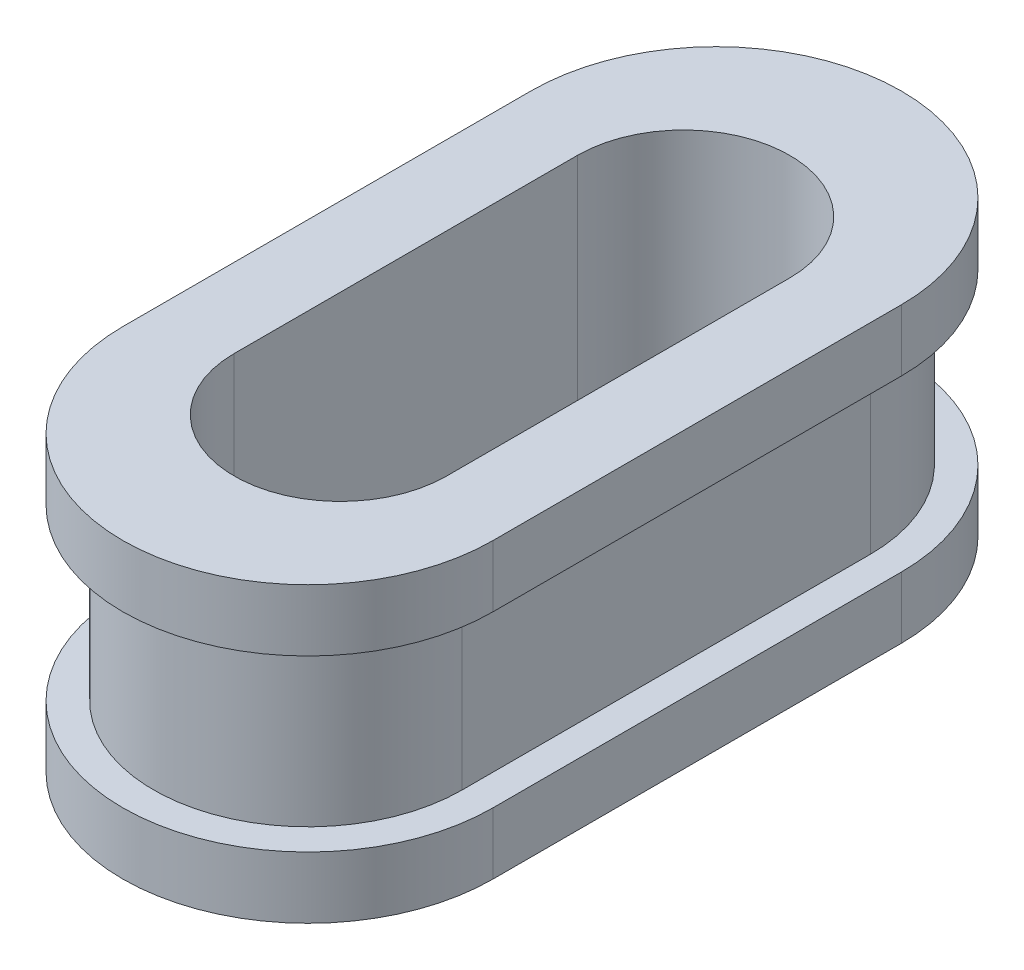
ISO-10303-21;
HEADER;
FILE_DESCRIPTION(('STEP AP214'),'2;1');
FILE_NAME('part.step','',(''),(''),'','','');
FILE_SCHEMA(('AUTOMOTIVE_DESIGN { 1 0 10303 214 1 1 1 1 }'));
ENDSEC;
DATA;
#1=APPLICATION_CONTEXT('core data for automotive mechanical design processes');
#2=APPLICATION_PROTOCOL_DEFINITION('international standard','automotive_design',2000,#1);
#3=PRODUCT_CONTEXT('',#1,'mechanical');
#4=PRODUCT('Part','Part','',(#3));
#5=PRODUCT_RELATED_PRODUCT_CATEGORY('part','',(#4));
#6=PRODUCT_DEFINITION_FORMATION('','',#4);
#7=PRODUCT_DEFINITION_CONTEXT('part definition',#1,'design');
#8=PRODUCT_DEFINITION('design','',#6,#7);
#9=PRODUCT_DEFINITION_SHAPE('','',#8);
#10=(LENGTH_UNIT() NAMED_UNIT(*) SI_UNIT(.MILLI.,.METRE.));
#11=(NAMED_UNIT(*) PLANE_ANGLE_UNIT() SI_UNIT($,.RADIAN.));
#12=(NAMED_UNIT(*) SI_UNIT($,.STERADIAN.) SOLID_ANGLE_UNIT());
#13=UNCERTAINTY_MEASURE_WITH_UNIT(LENGTH_MEASURE(1.E-05),#10,'distance_accuracy_value','');
#14=(GEOMETRIC_REPRESENTATION_CONTEXT(3) GLOBAL_UNCERTAINTY_ASSIGNED_CONTEXT((#13)) GLOBAL_UNIT_ASSIGNED_CONTEXT((#10,
#11,#12)) REPRESENTATION_CONTEXT('',''));
#15=CARTESIAN_POINT('',(0.,0.,0.));
#16=DIRECTION('',(0.,0.,1.));
#17=DIRECTION('',(1.,0.,0.));
#18=AXIS2_PLACEMENT_3D('',#15,#16,#17);
#19=CARTESIAN_POINT('',(0.,10.,-104.285653561065));
#20=DIRECTION('',(0.,-1.,0.));
#21=DIRECTION('',(0.,0.,-1.));
#22=AXIS2_PLACEMENT_3D('',#19,#20,#21);
#23=CYLINDRICAL_SURFACE('',#22,30.);
#24=CARTESIAN_POINT('',(0.,0.,-104.285653561065));
#25=DIRECTION('',(0.,1.,0.));
#26=DIRECTION('',(0.,0.,1.));
#27=AXIS2_PLACEMENT_3D('',#24,#25,#26);
#28=CIRCLE('',#27,30.);
#29=CARTESIAN_POINT('',(30.,0.,-104.285653561065));
#30=VERTEX_POINT('',#29);
#31=CARTESIAN_POINT('',(-30.,0.,-104.285653561065));
#32=VERTEX_POINT('',#31);
#33=EDGE_CURVE('E189',#30,#32,#28,.T.);
#34=ORIENTED_EDGE('',*,*,#33,.T.);
#35=DIRECTION('',(0.,-1.,0.));
#36=VECTOR('',#35,1.);
#37=CARTESIAN_POINT('',(-30.,10.,-104.285653561065));
#38=LINE('',#37,#36);
#39=CARTESIAN_POINT('',(-30.,10.,-104.285653561065));
#40=VERTEX_POINT('',#39);
#41=EDGE_CURVE('E227',#40,#32,#38,.T.);
#42=ORIENTED_EDGE('',*,*,#41,.F.);
#43=CARTESIAN_POINT('',(0.,10.,-104.285653561065));
#44=DIRECTION('',(0.,1.,0.));
#45=DIRECTION('',(0.,0.,1.));
#46=AXIS2_PLACEMENT_3D('',#43,#44,#45);
#47=CIRCLE('',#46,30.);
#48=CARTESIAN_POINT('',(30.,10.,-104.285653561065));
#49=VERTEX_POINT('',#48);
#50=EDGE_CURVE('E190',#49,#40,#47,.T.);
#51=ORIENTED_EDGE('',*,*,#50,.F.);
#52=DIRECTION('',(0.,-1.,0.));
#53=VECTOR('',#52,1.);
#54=CARTESIAN_POINT('',(30.,10.,-104.285653561065));
#55=LINE('',#54,#53);
#56=EDGE_CURVE('E204',#49,#30,#55,.T.);
#57=ORIENTED_EDGE('',*,*,#56,.T.);
#58=EDGE_LOOP('',(#34,#42,#51,#57));
#59=FACE_BOUND('',#58,.T.);
#60=ADVANCED_FACE('F39',(#59),#23,.T.);
#61=CARTESIAN_POINT('',(-30.,10.,-104.285653561065));
#62=DIRECTION('',(1.,0.,0.));
#63=DIRECTION('',(0.,0.,-1.));
#64=AXIS2_PLACEMENT_3D('',#61,#62,#63);
#65=PLANE('',#64);
#66=DIRECTION('',(0.,0.,1.));
#67=VECTOR('',#66,1.);
#68=CARTESIAN_POINT('',(-30.,0.,-104.285653561065));
#69=LINE('',#68,#67);
#70=CARTESIAN_POINT('',(-30.,0.,-38.1556535610648));
#71=VERTEX_POINT('',#70);
#72=EDGE_CURVE('E208',#32,#71,#69,.T.);
#73=ORIENTED_EDGE('',*,*,#72,.T.);
#74=DIRECTION('',(0.,-1.,0.));
#75=VECTOR('',#74,1.);
#76=CARTESIAN_POINT('',(-30.,10.,-38.1556535610648));
#77=LINE('',#76,#75);
#78=CARTESIAN_POINT('',(-30.,10.,-38.1556535610648));
#79=VERTEX_POINT('',#78);
#80=EDGE_CURVE('E223',#79,#71,#77,.T.);
#81=ORIENTED_EDGE('',*,*,#80,.F.);
#82=DIRECTION('',(0.,0.,1.));
#83=VECTOR('',#82,1.);
#84=CARTESIAN_POINT('',(-30.,10.,-104.285653561065));
#85=LINE('',#84,#83);
#86=EDGE_CURVE('E194',#40,#79,#85,.T.);
#87=ORIENTED_EDGE('',*,*,#86,.F.);
#88=ORIENTED_EDGE('',*,*,#41,.T.);
#89=EDGE_LOOP('',(#73,#81,#87,#88));
#90=FACE_BOUND('',#89,.T.);
#91=ADVANCED_FACE('F345',(#90),#65,.F.);
#92=CARTESIAN_POINT('',(0.,10.,-38.1556535610648));
#93=DIRECTION('',(0.,-1.,0.));
#94=DIRECTION('',(0.,0.,-1.));
#95=AXIS2_PLACEMENT_3D('',#92,#93,#94);
#96=CYLINDRICAL_SURFACE('',#95,30.);
#97=CARTESIAN_POINT('',(0.,0.,-38.1556535610648));
#98=DIRECTION('',(0.,1.,0.));
#99=DIRECTION('',(0.,0.,1.));
#100=AXIS2_PLACEMENT_3D('',#97,#98,#99);
#101=CIRCLE('',#100,30.);
#102=CARTESIAN_POINT('',(30.,0.,-38.1556535610648));
#103=VERTEX_POINT('',#102);
#104=EDGE_CURVE('E211',#71,#103,#101,.T.);
#105=ORIENTED_EDGE('',*,*,#104,.T.);
#106=DIRECTION('',(0.,-1.,0.));
#107=VECTOR('',#106,1.);
#108=CARTESIAN_POINT('',(30.,10.,-38.1556535610648));
#109=LINE('',#108,#107);
#110=CARTESIAN_POINT('',(30.,10.,-38.1556535610648));
#111=VERTEX_POINT('',#110);
#112=EDGE_CURVE('E219',#111,#103,#109,.T.);
#113=ORIENTED_EDGE('',*,*,#112,.F.);
#114=CARTESIAN_POINT('',(0.,10.,-38.1556535610648));
#115=DIRECTION('',(0.,1.,0.));
#116=DIRECTION('',(0.,0.,1.));
#117=AXIS2_PLACEMENT_3D('',#114,#115,#116);
#118=CIRCLE('',#117,30.);
#119=EDGE_CURVE('E198',#79,#111,#118,.T.);
#120=ORIENTED_EDGE('',*,*,#119,.F.);
#121=ORIENTED_EDGE('',*,*,#80,.T.);
#122=EDGE_LOOP('',(#105,#113,#120,#121));
#123=FACE_BOUND('',#122,.T.);
#124=ADVANCED_FACE('F350',(#123),#96,.T.);
#125=CARTESIAN_POINT('',(30.,10.,-104.285653561065));
#126=DIRECTION('',(-1.,0.,0.));
#127=DIRECTION('',(0.,0.,1.));
#128=AXIS2_PLACEMENT_3D('',#125,#126,#127);
#129=PLANE('',#128);
#130=DIRECTION('',(0.,0.,-1.));
#131=VECTOR('',#130,1.);
#132=CARTESIAN_POINT('',(30.,0.,-104.285653561065));
#133=LINE('',#132,#131);
#134=EDGE_CURVE('E195',#103,#30,#133,.T.);
#135=ORIENTED_EDGE('',*,*,#134,.T.);
#136=ORIENTED_EDGE('',*,*,#56,.F.);
#137=DIRECTION('',(0.,0.,-1.));
#138=VECTOR('',#137,1.);
#139=CARTESIAN_POINT('',(30.,10.,-104.285653561065));
#140=LINE('',#139,#138);
#141=EDGE_CURVE('E201',#111,#49,#140,.T.);
#142=ORIENTED_EDGE('',*,*,#141,.F.);
#143=ORIENTED_EDGE('',*,*,#112,.T.);
#144=EDGE_LOOP('',(#135,#136,#142,#143));
#145=FACE_BOUND('',#144,.T.);
#146=ADVANCED_FACE('F365',(#145),#129,.F.);
#147=CARTESIAN_POINT('',(0.,10.,-104.285653561065));
#148=DIRECTION('',(0.,1.,0.));
#149=DIRECTION('',(0.,0.,1.));
#150=AXIS2_PLACEMENT_3D('',#147,#148,#149);
#151=PLANE('',#150);
#152=CARTESIAN_POINT('',(0.,10.,-104.285653561065));
#153=DIRECTION('',(0.,1.,0.));
#154=DIRECTION('',(0.,0.,1.));
#155=AXIS2_PLACEMENT_3D('',#152,#153,#154);
#156=CIRCLE('',#155,25.);
#157=CARTESIAN_POINT('',(25.,10.,-104.285653561065));
#158=VERTEX_POINT('',#157);
#159=CARTESIAN_POINT('',(-25.,10.,-104.285653561065));
#160=VERTEX_POINT('',#159);
#161=EDGE_CURVE('E146',#158,#160,#156,.T.);
#162=ORIENTED_EDGE('',*,*,#161,.F.);
#163=DIRECTION('',(0.,0.,-1.));
#164=VECTOR('',#163,1.);
#165=CARTESIAN_POINT('',(25.,10.,-104.285653561065));
#166=LINE('',#165,#164);
#167=CARTESIAN_POINT('',(25.,10.,-38.1556535610648));
#168=VERTEX_POINT('',#167);
#169=EDGE_CURVE('E143',#168,#158,#166,.T.);
#170=ORIENTED_EDGE('',*,*,#169,.F.);
#171=CARTESIAN_POINT('',(0.,10.,-38.1556535610648));
#172=DIRECTION('',(0.,1.,0.));
#173=DIRECTION('',(0.,0.,1.));
#174=AXIS2_PLACEMENT_3D('',#171,#172,#173);
#175=CIRCLE('',#174,25.);
#176=CARTESIAN_POINT('',(-25.,10.,-38.1556535610648));
#177=VERTEX_POINT('',#176);
#178=EDGE_CURVE('E168',#177,#168,#175,.T.);
#179=ORIENTED_EDGE('',*,*,#178,.F.);
#180=DIRECTION('',(0.,0.,1.));
#181=VECTOR('',#180,1.);
#182=CARTESIAN_POINT('',(-25.,10.,-104.285653561065));
#183=LINE('',#182,#181);
#184=EDGE_CURVE('E150',#160,#177,#183,.T.);
#185=ORIENTED_EDGE('',*,*,#184,.F.);
#186=EDGE_LOOP('',(#162,#170,#179,#185));
#187=FACE_BOUND('',#186,.T.);
#188=ORIENTED_EDGE('',*,*,#50,.T.);
#189=ORIENTED_EDGE('',*,*,#86,.T.);
#190=ORIENTED_EDGE('',*,*,#119,.T.);
#191=ORIENTED_EDGE('',*,*,#141,.T.);
#192=EDGE_LOOP('',(#188,#189,#190,#191));
#193=FACE_BOUND('',#192,.T.);
#194=ADVANCED_FACE('F147',(#187,#193),#151,.T.);
#195=CARTESIAN_POINT('',(0.,0.,-104.285653561065));
#196=DIRECTION('',(0.,1.,0.));
#197=DIRECTION('',(0.,0.,1.));
#198=AXIS2_PLACEMENT_3D('',#195,#196,#197);
#199=PLANE('',#198);
#200=DIRECTION('',(0.,0.,-1.));
#201=VECTOR('',#200,1.);
#202=CARTESIAN_POINT('',(17.2,0.,-99.0206535610648));
#203=LINE('',#202,#201);
#204=CARTESIAN_POINT('',(17.2,0.,-43.4206535610648));
#205=VERTEX_POINT('',#204);
#206=CARTESIAN_POINT('',(17.2,0.,-99.0206535610648));
#207=VERTEX_POINT('',#206);
#208=EDGE_CURVE('E247',#205,#207,#203,.T.);
#209=ORIENTED_EDGE('',*,*,#208,.T.);
#210=CARTESIAN_POINT('',(0.,0.,-99.0206535610648));
#211=DIRECTION('',(0.,1.,0.));
#212=DIRECTION('',(0.,0.,1.));
#213=AXIS2_PLACEMENT_3D('',#210,#211,#212);
#214=CIRCLE('',#213,17.2);
#215=CARTESIAN_POINT('',(-17.2,0.,-99.0206535610648));
#216=VERTEX_POINT('',#215);
#217=EDGE_CURVE('E262',#207,#216,#214,.T.);
#218=ORIENTED_EDGE('',*,*,#217,.T.);
#219=DIRECTION('',(0.,0.,1.));
#220=VECTOR('',#219,1.);
#221=CARTESIAN_POINT('',(-17.2,0.,-99.0206535610648));
#222=LINE('',#221,#220);
#223=CARTESIAN_POINT('',(-17.2,0.,-43.4206535610648));
#224=VERTEX_POINT('',#223);
#225=EDGE_CURVE('E536',#216,#224,#222,.T.);
#226=ORIENTED_EDGE('',*,*,#225,.T.);
#227=CARTESIAN_POINT('',(0.,0.,-43.4206535610648));
#228=DIRECTION('',(0.,1.,0.));
#229=DIRECTION('',(0.,0.,1.));
#230=AXIS2_PLACEMENT_3D('',#227,#228,#229);
#231=CIRCLE('',#230,17.2);
#232=EDGE_CURVE('E55',#224,#205,#231,.T.);
#233=ORIENTED_EDGE('',*,*,#232,.T.);
#234=EDGE_LOOP('',(#209,#218,#226,#233));
#235=FACE_BOUND('',#234,.T.);
#236=ORIENTED_EDGE('',*,*,#33,.F.);
#237=ORIENTED_EDGE('',*,*,#134,.F.);
#238=ORIENTED_EDGE('',*,*,#104,.F.);
#239=ORIENTED_EDGE('',*,*,#72,.F.);
#240=EDGE_LOOP('',(#236,#237,#238,#239));
#241=FACE_BOUND('',#240,.T.);
#242=ADVANCED_FACE('F358',(#235,#241),#199,.F.);
#243=CARTESIAN_POINT('',(0.,37.5,-104.285653561065));
#244=DIRECTION('',(0.,-1.,0.));
#245=DIRECTION('',(0.,0.,-1.));
#246=AXIS2_PLACEMENT_3D('',#243,#244,#245);
#247=CYLINDRICAL_SURFACE('',#246,25.);
#248=ORIENTED_EDGE('',*,*,#161,.T.);
#249=DIRECTION('',(0.,-1.,0.));
#250=VECTOR('',#249,1.);
#251=CARTESIAN_POINT('',(-25.,37.5,-104.285653561065));
#252=LINE('',#251,#250);
#253=CARTESIAN_POINT('',(-25.,37.5,-104.285653561065));
#254=VERTEX_POINT('',#253);
#255=EDGE_CURVE('E186',#254,#160,#252,.T.);
#256=ORIENTED_EDGE('',*,*,#255,.F.);
#257=CARTESIAN_POINT('',(0.,37.5,-104.285653561065));
#258=DIRECTION('',(0.,1.,0.));
#259=DIRECTION('',(0.,0.,1.));
#260=AXIS2_PLACEMENT_3D('',#257,#258,#259);
#261=CIRCLE('',#260,25.);
#262=CARTESIAN_POINT('',(25.,37.5,-104.285653561065));
#263=VERTEX_POINT('',#262);
#264=EDGE_CURVE('E167',#263,#254,#261,.T.);
#265=ORIENTED_EDGE('',*,*,#264,.F.);
#266=DIRECTION('',(0.,-1.,0.));
#267=VECTOR('',#266,1.);
#268=CARTESIAN_POINT('',(25.,37.5,-104.285653561065));
#269=LINE('',#268,#267);
#270=EDGE_CURVE('E163',#263,#158,#269,.T.);
#271=ORIENTED_EDGE('',*,*,#270,.T.);
#272=EDGE_LOOP('',(#248,#256,#265,#271));
#273=FACE_BOUND('',#272,.T.);
#274=ADVANCED_FACE('F170',(#273),#247,.T.);
#275=CARTESIAN_POINT('',(-25.,37.5,-104.285653561065));
#276=DIRECTION('',(1.,0.,0.));
#277=DIRECTION('',(0.,0.,-1.));
#278=AXIS2_PLACEMENT_3D('',#275,#276,#277);
#279=PLANE('',#278);
#280=ORIENTED_EDGE('',*,*,#184,.T.);
#281=DIRECTION('',(0.,-1.,0.));
#282=VECTOR('',#281,1.);
#283=CARTESIAN_POINT('',(-25.,37.5,-38.1556535610648));
#284=LINE('',#283,#282);
#285=CARTESIAN_POINT('',(-25.,37.5,-38.1556535610648));
#286=VERTEX_POINT('',#285);
#287=EDGE_CURVE('E177',#286,#177,#284,.T.);
#288=ORIENTED_EDGE('',*,*,#287,.F.);
#289=DIRECTION('',(0.,0.,1.));
#290=VECTOR('',#289,1.);
#291=CARTESIAN_POINT('',(-25.,37.5,-104.285653561065));
#292=LINE('',#291,#290);
#293=EDGE_CURVE('E315',#254,#286,#292,.T.);
#294=ORIENTED_EDGE('',*,*,#293,.F.);
#295=ORIENTED_EDGE('',*,*,#255,.T.);
#296=EDGE_LOOP('',(#280,#288,#294,#295));
#297=FACE_BOUND('',#296,.T.);
#298=ADVANCED_FACE('F328',(#297),#279,.F.);
#299=CARTESIAN_POINT('',(0.,37.5,-38.1556535610648));
#300=DIRECTION('',(0.,-1.,0.));
#301=DIRECTION('',(0.,0.,-1.));
#302=AXIS2_PLACEMENT_3D('',#299,#300,#301);
#303=CYLINDRICAL_SURFACE('',#302,25.);
#304=ORIENTED_EDGE('',*,*,#178,.T.);
#305=DIRECTION('',(0.,-1.,0.));
#306=VECTOR('',#305,1.);
#307=CARTESIAN_POINT('',(25.,37.5,-38.1556535610648));
#308=LINE('',#307,#306);
#309=CARTESIAN_POINT('',(25.,37.5,-38.1556535610648));
#310=VERTEX_POINT('',#309);
#311=EDGE_CURVE('E165',#310,#168,#308,.T.);
#312=ORIENTED_EDGE('',*,*,#311,.F.);
#313=CARTESIAN_POINT('',(0.,37.5,-38.1556535610648));
#314=DIRECTION('',(0.,1.,0.));
#315=DIRECTION('',(0.,0.,1.));
#316=AXIS2_PLACEMENT_3D('',#313,#314,#315);
#317=CIRCLE('',#316,25.);
#318=EDGE_CURVE('E179',#286,#310,#317,.T.);
#319=ORIENTED_EDGE('',*,*,#318,.F.);
#320=ORIENTED_EDGE('',*,*,#287,.T.);
#321=EDGE_LOOP('',(#304,#312,#319,#320));
#322=FACE_BOUND('',#321,.T.);
#323=ADVANCED_FACE('F325',(#322),#303,.T.);
#324=CARTESIAN_POINT('',(25.,37.5,-104.285653561065));
#325=DIRECTION('',(-1.,0.,0.));
#326=DIRECTION('',(0.,0.,1.));
#327=AXIS2_PLACEMENT_3D('',#324,#325,#326);
#328=PLANE('',#327);
#329=ORIENTED_EDGE('',*,*,#169,.T.);
#330=ORIENTED_EDGE('',*,*,#270,.F.);
#331=DIRECTION('',(0.,0.,-1.));
#332=VECTOR('',#331,1.);
#333=CARTESIAN_POINT('',(25.,37.5,-104.285653561065));
#334=LINE('',#333,#332);
#335=EDGE_CURVE('E173',#310,#263,#334,.T.);
#336=ORIENTED_EDGE('',*,*,#335,.F.);
#337=ORIENTED_EDGE('',*,*,#311,.T.);
#338=EDGE_LOOP('',(#329,#330,#336,#337));
#339=FACE_BOUND('',#338,.T.);
#340=ADVANCED_FACE('F161',(#339),#328,.F.);
#341=CARTESIAN_POINT('',(0.,37.5,-104.285653561065));
#342=DIRECTION('',(0.,1.,0.));
#343=DIRECTION('',(0.,0.,1.));
#344=AXIS2_PLACEMENT_3D('',#341,#342,#343);
#345=PLANE('',#344);
#346=CARTESIAN_POINT('',(0.,37.5,-104.285653561065));
#347=DIRECTION('',(0.,1.,0.));
#348=DIRECTION('',(0.,0.,1.));
#349=AXIS2_PLACEMENT_3D('',#346,#347,#348);
#350=CIRCLE('',#349,30.);
#351=CARTESIAN_POINT('',(30.,37.5,-104.285653561065));
#352=VERTEX_POINT('',#351);
#353=CARTESIAN_POINT('',(-30.,37.5,-104.285653561065));
#354=VERTEX_POINT('',#353);
#355=EDGE_CURVE('E264',#352,#354,#350,.T.);
#356=ORIENTED_EDGE('',*,*,#355,.F.);
#357=DIRECTION('',(0.,0.,-1.));
#358=VECTOR('',#357,1.);
#359=CARTESIAN_POINT('',(30.,37.5,-38.1556535610648));
#360=LINE('',#359,#358);
#361=CARTESIAN_POINT('',(30.,37.5,-38.1556535610648));
#362=VERTEX_POINT('',#361);
#363=EDGE_CURVE('E280',#362,#352,#360,.T.);
#364=ORIENTED_EDGE('',*,*,#363,.F.);
#365=CARTESIAN_POINT('',(0.,37.5,-38.1556535610648));
#366=DIRECTION('',(0.,1.,0.));
#367=DIRECTION('',(0.,0.,1.));
#368=AXIS2_PLACEMENT_3D('',#365,#366,#367);
#369=CIRCLE('',#368,30.);
#370=CARTESIAN_POINT('',(-30.,37.5,-38.1556535610649));
#371=VERTEX_POINT('',#370);
#372=EDGE_CURVE('E295',#371,#362,#369,.T.);
#373=ORIENTED_EDGE('',*,*,#372,.F.);
#374=DIRECTION('',(0.,0.,1.));
#375=VECTOR('',#374,1.);
#376=CARTESIAN_POINT('',(-30.,37.5,-104.285653561065));
#377=LINE('',#376,#375);
#378=EDGE_CURVE('E83',#354,#371,#377,.T.);
#379=ORIENTED_EDGE('',*,*,#378,.F.);
#380=EDGE_LOOP('',(#356,#364,#373,#379));
#381=FACE_BOUND('',#380,.T.);
#382=ORIENTED_EDGE('',*,*,#335,.T.);
#383=ORIENTED_EDGE('',*,*,#264,.T.);
#384=ORIENTED_EDGE('',*,*,#293,.T.);
#385=ORIENTED_EDGE('',*,*,#318,.T.);
#386=EDGE_LOOP('',(#382,#383,#384,#385));
#387=FACE_BOUND('',#386,.T.);
#388=ADVANCED_FACE('F330',(#381,#387),#345,.F.);
#389=CARTESIAN_POINT('',(0.,47.5,-104.285653561065));
#390=DIRECTION('',(0.,-1.,0.));
#391=DIRECTION('',(0.,0.,-1.));
#392=AXIS2_PLACEMENT_3D('',#389,#390,#391);
#393=CYLINDRICAL_SURFACE('',#392,30.);
#394=ORIENTED_EDGE('',*,*,#355,.T.);
#395=DIRECTION('',(0.,-1.,0.));
#396=VECTOR('',#395,1.);
#397=CARTESIAN_POINT('',(-30.,47.5,-104.285653561065));
#398=LINE('',#397,#396);
#399=CARTESIAN_POINT('',(-30.,47.5,-104.285653561065));
#400=VERTEX_POINT('',#399);
#401=EDGE_CURVE('E156',#400,#354,#398,.T.);
#402=ORIENTED_EDGE('',*,*,#401,.F.);
#403=CARTESIAN_POINT('',(0.,47.5,-104.285653561065));
#404=DIRECTION('',(0.,1.,0.));
#405=DIRECTION('',(0.,0.,1.));
#406=AXIS2_PLACEMENT_3D('',#403,#404,#405);
#407=CIRCLE('',#406,30.);
#408=CARTESIAN_POINT('',(30.,47.5,-104.285653561065));
#409=VERTEX_POINT('',#408);
#410=EDGE_CURVE('E275',#409,#400,#407,.T.);
#411=ORIENTED_EDGE('',*,*,#410,.F.);
#412=DIRECTION('',(0.,-1.,0.));
#413=VECTOR('',#412,1.);
#414=CARTESIAN_POINT('',(30.,47.5,-104.285653561065));
#415=LINE('',#414,#413);
#416=EDGE_CURVE('E291',#409,#352,#415,.T.);
#417=ORIENTED_EDGE('',*,*,#416,.T.);
#418=EDGE_LOOP('',(#394,#402,#411,#417));
#419=FACE_BOUND('',#418,.T.);
#420=ADVANCED_FACE('F332',(#419),#393,.T.);
#421=CARTESIAN_POINT('',(-30.,47.5,-104.285653561065));
#422=DIRECTION('',(1.,0.,0.));
#423=DIRECTION('',(0.,0.,-1.));
#424=AXIS2_PLACEMENT_3D('',#421,#422,#423);
#425=PLANE('',#424);
#426=ORIENTED_EDGE('',*,*,#378,.T.);
#427=DIRECTION('',(0.,-1.,0.));
#428=VECTOR('',#427,1.);
#429=CARTESIAN_POINT('',(-30.,47.5,-38.1556535610649));
#430=LINE('',#429,#428);
#431=CARTESIAN_POINT('',(-30.,47.5,-38.1556535610649));
#432=VERTEX_POINT('',#431);
#433=EDGE_CURVE('E307',#432,#371,#430,.T.);
#434=ORIENTED_EDGE('',*,*,#433,.F.);
#435=DIRECTION('',(0.,0.,1.));
#436=VECTOR('',#435,1.);
#437=CARTESIAN_POINT('',(-30.,47.5,-104.285653561065));
#438=LINE('',#437,#436);
#439=EDGE_CURVE('E279',#400,#432,#438,.T.);
#440=ORIENTED_EDGE('',*,*,#439,.F.);
#441=ORIENTED_EDGE('',*,*,#401,.T.);
#442=EDGE_LOOP('',(#426,#434,#440,#441));
#443=FACE_BOUND('',#442,.T.);
#444=ADVANCED_FACE('F338',(#443),#425,.F.);
#445=CARTESIAN_POINT('',(0.,47.5,-38.1556535610648));
#446=DIRECTION('',(0.,-1.,0.));
#447=DIRECTION('',(0.,0.,-1.));
#448=AXIS2_PLACEMENT_3D('',#445,#446,#447);
#449=CYLINDRICAL_SURFACE('',#448,30.);
#450=ORIENTED_EDGE('',*,*,#372,.T.);
#451=DIRECTION('',(0.,-1.,0.));
#452=VECTOR('',#451,1.);
#453=CARTESIAN_POINT('',(30.,47.5,-38.1556535610648));
#454=LINE('',#453,#452);
#455=CARTESIAN_POINT('',(30.,47.5,-38.1556535610648));
#456=VERTEX_POINT('',#455);
#457=EDGE_CURVE('E303',#456,#362,#454,.T.);
#458=ORIENTED_EDGE('',*,*,#457,.F.);
#459=CARTESIAN_POINT('',(0.,47.5,-38.1556535610648));
#460=DIRECTION('',(0.,1.,0.));
#461=DIRECTION('',(0.,0.,1.));
#462=AXIS2_PLACEMENT_3D('',#459,#460,#461);
#463=CIRCLE('',#462,30.);
#464=EDGE_CURVE('E284',#432,#456,#463,.T.);
#465=ORIENTED_EDGE('',*,*,#464,.F.);
#466=ORIENTED_EDGE('',*,*,#433,.T.);
#467=EDGE_LOOP('',(#450,#458,#465,#466));
#468=FACE_BOUND('',#467,.T.);
#469=ADVANCED_FACE('F387',(#468),#449,.T.);
#470=CARTESIAN_POINT('',(30.,47.5,-38.1556535610648));
#471=DIRECTION('',(-1.,0.,0.));
#472=DIRECTION('',(0.,0.,1.));
#473=AXIS2_PLACEMENT_3D('',#470,#471,#472);
#474=PLANE('',#473);
#475=ORIENTED_EDGE('',*,*,#363,.T.);
#476=ORIENTED_EDGE('',*,*,#416,.F.);
#477=DIRECTION('',(0.,0.,-1.));
#478=VECTOR('',#477,1.);
#479=CARTESIAN_POINT('',(30.,47.5,-38.1556535610648));
#480=LINE('',#479,#478);
#481=EDGE_CURVE('E288',#456,#409,#480,.T.);
#482=ORIENTED_EDGE('',*,*,#481,.F.);
#483=ORIENTED_EDGE('',*,*,#457,.T.);
#484=EDGE_LOOP('',(#475,#476,#482,#483));
#485=FACE_BOUND('',#484,.T.);
#486=ADVANCED_FACE('F390',(#485),#474,.F.);
#487=CARTESIAN_POINT('',(0.,47.5,-104.285653561065));
#488=DIRECTION('',(0.,1.,0.));
#489=DIRECTION('',(0.,0.,1.));
#490=AXIS2_PLACEMENT_3D('',#487,#488,#489);
#491=PLANE('',#490);
#492=CARTESIAN_POINT('',(0.,47.5,-99.0206535610648));
#493=DIRECTION('',(0.,1.,0.));
#494=DIRECTION('',(0.,0.,1.));
#495=AXIS2_PLACEMENT_3D('',#492,#493,#494);
#496=CIRCLE('',#495,17.2);
#497=CARTESIAN_POINT('',(17.2,47.5,-99.0206535610648));
#498=VERTEX_POINT('',#497);
#499=CARTESIAN_POINT('',(-17.2,47.5,-99.0206535610648));
#500=VERTEX_POINT('',#499);
#501=EDGE_CURVE('E11',#498,#500,#496,.T.);
#502=ORIENTED_EDGE('',*,*,#501,.F.);
#503=DIRECTION('',(0.,0.,-1.));
#504=VECTOR('',#503,1.);
#505=CARTESIAN_POINT('',(17.2,47.5,-99.0206535610648));
#506=LINE('',#505,#504);
#507=CARTESIAN_POINT('',(17.2,47.5,-43.4206535610648));
#508=VERTEX_POINT('',#507);
#509=EDGE_CURVE('E48',#508,#498,#506,.T.);
#510=ORIENTED_EDGE('',*,*,#509,.F.);
#511=CARTESIAN_POINT('',(0.,47.5,-43.4206535610648));
#512=DIRECTION('',(0.,1.,0.));
#513=DIRECTION('',(0.,0.,1.));
#514=AXIS2_PLACEMENT_3D('',#511,#512,#513);
#515=CIRCLE('',#514,17.2);
#516=CARTESIAN_POINT('',(-17.2,47.5,-43.4206535610648));
#517=VERTEX_POINT('',#516);
#518=EDGE_CURVE('E234',#517,#508,#515,.T.);
#519=ORIENTED_EDGE('',*,*,#518,.F.);
#520=DIRECTION('',(0.,0.,1.));
#521=VECTOR('',#520,1.);
#522=CARTESIAN_POINT('',(-17.2,47.5,-99.0206535610648));
#523=LINE('',#522,#521);
#524=EDGE_CURVE('E231',#500,#517,#523,.T.);
#525=ORIENTED_EDGE('',*,*,#524,.F.);
#526=EDGE_LOOP('',(#502,#510,#519,#525));
#527=FACE_BOUND('',#526,.T.);
#528=ORIENTED_EDGE('',*,*,#410,.T.);
#529=ORIENTED_EDGE('',*,*,#439,.T.);
#530=ORIENTED_EDGE('',*,*,#464,.T.);
#531=ORIENTED_EDGE('',*,*,#481,.T.);
#532=EDGE_LOOP('',(#528,#529,#530,#531));
#533=FACE_BOUND('',#532,.T.);
#534=ADVANCED_FACE('F252',(#527,#533),#491,.T.);
#535=CARTESIAN_POINT('',(0.,0.,-99.0206535610648));
#536=DIRECTION('',(0.,1.,0.));
#537=DIRECTION('',(0.,0.,1.));
#538=AXIS2_PLACEMENT_3D('',#535,#536,#537);
#539=CYLINDRICAL_SURFACE('',#538,17.2);
#540=ORIENTED_EDGE('',*,*,#501,.T.);
#541=DIRECTION('',(0.,1.,0.));
#542=VECTOR('',#541,1.);
#543=CARTESIAN_POINT('',(-17.2,0.,-99.0206535610648));
#544=LINE('',#543,#542);
#545=EDGE_CURVE('E259',#216,#500,#544,.T.);
#546=ORIENTED_EDGE('',*,*,#545,.F.);
#547=ORIENTED_EDGE('',*,*,#217,.F.);
#548=DIRECTION('',(0.,1.,0.));
#549=VECTOR('',#548,1.);
#550=CARTESIAN_POINT('',(17.2,0.,-99.0206535610648));
#551=LINE('',#550,#549);
#552=EDGE_CURVE('E249',#207,#498,#551,.T.);
#553=ORIENTED_EDGE('',*,*,#552,.T.);
#554=EDGE_LOOP('',(#540,#546,#547,#553));
#555=FACE_BOUND('',#554,.T.);
#556=ADVANCED_FACE('F256',(#555),#539,.F.);
#557=CARTESIAN_POINT('',(17.2,0.,-99.0206535610648));
#558=DIRECTION('',(1.,0.,0.));
#559=DIRECTION('',(0.,0.,-1.));
#560=AXIS2_PLACEMENT_3D('',#557,#558,#559);
#561=PLANE('',#560);
#562=ORIENTED_EDGE('',*,*,#509,.T.);
#563=ORIENTED_EDGE('',*,*,#552,.F.);
#564=ORIENTED_EDGE('',*,*,#208,.F.);
#565=DIRECTION('',(0.,1.,0.));
#566=VECTOR('',#565,1.);
#567=CARTESIAN_POINT('',(17.2,0.,-43.4206535610648));
#568=LINE('',#567,#566);
#569=EDGE_CURVE('E240',#205,#508,#568,.T.);
#570=ORIENTED_EDGE('',*,*,#569,.T.);
#571=EDGE_LOOP('',(#562,#563,#564,#570));
#572=FACE_BOUND('',#571,.T.);
#573=ADVANCED_FACE('F245',(#572),#561,.F.);
#574=CARTESIAN_POINT('',(0.,0.,-43.4206535610648));
#575=DIRECTION('',(0.,1.,0.));
#576=DIRECTION('',(0.,0.,1.));
#577=AXIS2_PLACEMENT_3D('',#574,#575,#576);
#578=CYLINDRICAL_SURFACE('',#577,17.2);
#579=ORIENTED_EDGE('',*,*,#518,.T.);
#580=ORIENTED_EDGE('',*,*,#569,.F.);
#581=ORIENTED_EDGE('',*,*,#232,.F.);
#582=DIRECTION('',(0.,1.,0.));
#583=VECTOR('',#582,1.);
#584=CARTESIAN_POINT('',(-17.2,0.,-43.4206535610648));
#585=LINE('',#584,#583);
#586=EDGE_CURVE('E242',#224,#517,#585,.T.);
#587=ORIENTED_EDGE('',*,*,#586,.T.);
#588=EDGE_LOOP('',(#579,#580,#581,#587));
#589=FACE_BOUND('',#588,.T.);
#590=ADVANCED_FACE('F238',(#589),#578,.F.);
#591=CARTESIAN_POINT('',(-17.2,0.,-99.0206535610648));
#592=DIRECTION('',(-1.,0.,0.));
#593=DIRECTION('',(0.,0.,1.));
#594=AXIS2_PLACEMENT_3D('',#591,#592,#593);
#595=PLANE('',#594);
#596=ORIENTED_EDGE('',*,*,#524,.T.);
#597=ORIENTED_EDGE('',*,*,#586,.F.);
#598=ORIENTED_EDGE('',*,*,#225,.F.);
#599=ORIENTED_EDGE('',*,*,#545,.T.);
#600=EDGE_LOOP('',(#596,#597,#598,#599));
#601=FACE_BOUND('',#600,.T.);
#602=ADVANCED_FACE('F418',(#601),#595,.F.);
#603=CLOSED_SHELL('',(#60,#91,#124,#146,#194,#242,#274,#298,#323,#340,#388,#420,#444,#469,#486,
#534,#556,#573,#590,#602));
#604=MANIFOLD_SOLID_BREP('B2',#603);
#605=ADVANCED_BREP_SHAPE_REPRESENTATION('',(#18,#604),#14);
#606=SHAPE_DEFINITION_REPRESENTATION(#9,#605);
ENDSEC;
END-ISO-10303-21;
